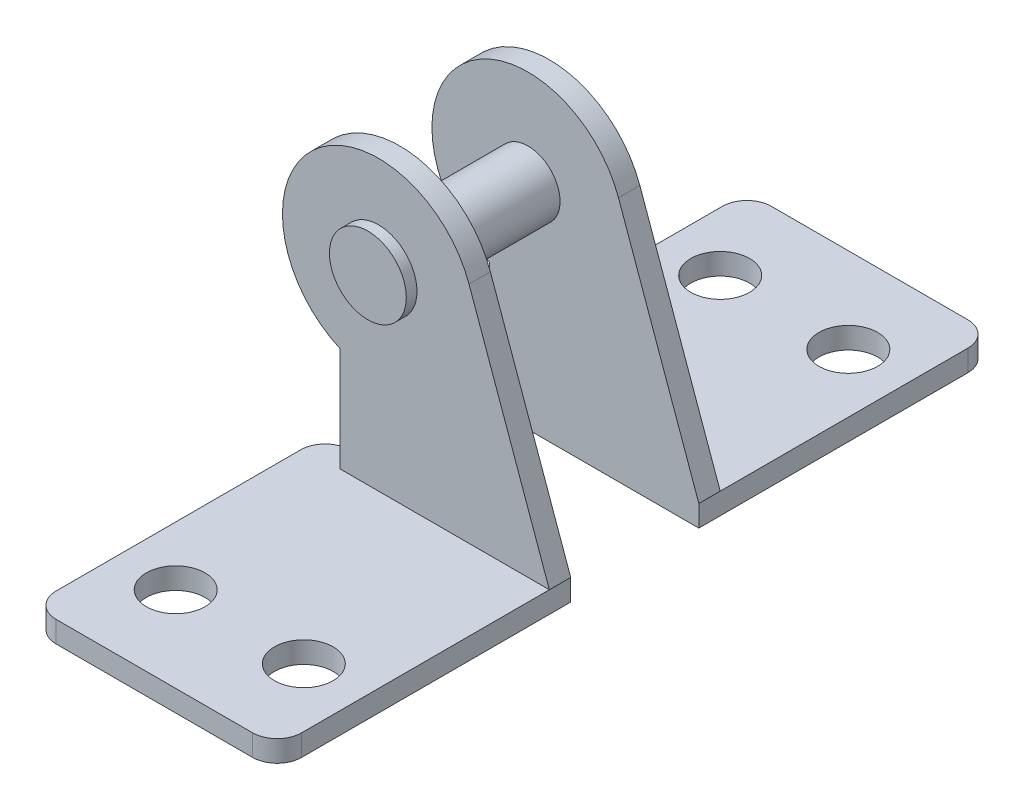
ISO-10303-21;
HEADER;
FILE_DESCRIPTION(('STEP AP214'),'2;1');
FILE_NAME('part.step','',(''),(''),'','','');
FILE_SCHEMA(('AUTOMOTIVE_DESIGN { 1 0 10303 214 1 1 1 1 }'));
ENDSEC;
DATA;
#1=APPLICATION_CONTEXT('core data for automotive mechanical design processes');
#2=APPLICATION_PROTOCOL_DEFINITION('international standard','automotive_design',2000,#1);
#3=PRODUCT_CONTEXT('',#1,'mechanical');
#4=PRODUCT('Part','Part','',(#3));
#5=PRODUCT_RELATED_PRODUCT_CATEGORY('part','',(#4));
#6=PRODUCT_DEFINITION_FORMATION('','',#4);
#7=PRODUCT_DEFINITION_CONTEXT('part definition',#1,'design');
#8=PRODUCT_DEFINITION('design','',#6,#7);
#9=PRODUCT_DEFINITION_SHAPE('','',#8);
#10=(LENGTH_UNIT() NAMED_UNIT(*) SI_UNIT(.MILLI.,.METRE.));
#11=(NAMED_UNIT(*) PLANE_ANGLE_UNIT() SI_UNIT($,.RADIAN.));
#12=(NAMED_UNIT(*) SI_UNIT($,.STERADIAN.) SOLID_ANGLE_UNIT());
#13=UNCERTAINTY_MEASURE_WITH_UNIT(LENGTH_MEASURE(1.E-05),#10,'distance_accuracy_value','');
#14=(GEOMETRIC_REPRESENTATION_CONTEXT(3) GLOBAL_UNCERTAINTY_ASSIGNED_CONTEXT((#13)) GLOBAL_UNIT_ASSIGNED_CONTEXT((#10,
#11,#12)) REPRESENTATION_CONTEXT('',''));
#15=CARTESIAN_POINT('',(0.,0.,0.));
#16=DIRECTION('',(0.,0.,1.));
#17=DIRECTION('',(1.,0.,0.));
#18=AXIS2_PLACEMENT_3D('',#15,#16,#17);
#19=CARTESIAN_POINT('',(-11.5,2.,-33.5));
#20=DIRECTION('',(0.,1.,0.));
#21=DIRECTION('',(0.,0.,1.));
#22=AXIS2_PLACEMENT_3D('',#19,#20,#21);
#23=PLANE('',#22);
#24=CARTESIAN_POINT('',(-5.99999999999999,2.,25.5));
#25=DIRECTION('',(0.,1.,0.));
#26=DIRECTION('',(0.,0.,-1.));
#27=AXIS2_PLACEMENT_3D('',#24,#25,#26);
#28=CIRCLE('',#27,2.75);
#29=CARTESIAN_POINT('',(-5.99999999999999,2.,22.75));
#30=VERTEX_POINT('',#29);
#31=EDGE_CURVE('E484',#30,#30,#28,.T.);
#32=ORIENTED_EDGE('',*,*,#31,.F.);
#33=EDGE_LOOP('',(#32));
#34=FACE_BOUND('',#33,.T.);
#35=CARTESIAN_POINT('',(6.00000000000001,2.,25.5));
#36=DIRECTION('',(0.,1.,0.));
#37=DIRECTION('',(0.,0.,1.));
#38=AXIS2_PLACEMENT_3D('',#35,#36,#37);
#39=CIRCLE('',#38,2.75);
#40=CARTESIAN_POINT('',(6.00000000000001,2.,28.25));
#41=VERTEX_POINT('',#40);
#42=EDGE_CURVE('E478',#41,#41,#39,.T.);
#43=ORIENTED_EDGE('',*,*,#42,.F.);
#44=EDGE_LOOP('',(#43));
#45=FACE_BOUND('',#44,.T.);
#46=DIRECTION('',(1.,0.,0.));
#47=VECTOR('',#46,1.);
#48=CARTESIAN_POINT('',(-11.5,2.,6.));
#49=LINE('',#48,#47);
#50=CARTESIAN_POINT('',(-9.2,2.,6.));
#51=VERTEX_POINT('',#50);
#52=CARTESIAN_POINT('',(-8.1,2.,6.));
#53=VERTEX_POINT('',#52);
#54=EDGE_CURVE('E313',#51,#53,#49,.T.);
#55=ORIENTED_EDGE('',*,*,#54,.F.);
#56=CARTESIAN_POINT('',(-9.2,2.,8.3));
#57=DIRECTION('',(0.,1.,0.));
#58=DIRECTION('',(0.,0.,1.));
#59=AXIS2_PLACEMENT_3D('',#56,#57,#58);
#60=CIRCLE('',#59,2.3);
#61=CARTESIAN_POINT('',(-11.5,2.,8.3));
#62=VERTEX_POINT('',#61);
#63=EDGE_CURVE('E234',#51,#62,#60,.T.);
#64=ORIENTED_EDGE('',*,*,#63,.T.);
#65=DIRECTION('',(0.,0.,1.));
#66=VECTOR('',#65,1.);
#67=CARTESIAN_POINT('',(-11.5,2.,-33.5));
#68=LINE('',#67,#66);
#69=CARTESIAN_POINT('',(-11.5,2.,31.2));
#70=VERTEX_POINT('',#69);
#71=EDGE_CURVE('E289',#62,#70,#68,.T.);
#72=ORIENTED_EDGE('',*,*,#71,.T.);
#73=CARTESIAN_POINT('',(-9.2,2.,31.2));
#74=DIRECTION('',(0.,1.,0.));
#75=DIRECTION('',(0.,0.,1.));
#76=AXIS2_PLACEMENT_3D('',#73,#74,#75);
#77=CIRCLE('',#76,2.3);
#78=CARTESIAN_POINT('',(-9.2,2.,33.5));
#79=VERTEX_POINT('',#78);
#80=EDGE_CURVE('E232',#70,#79,#77,.T.);
#81=ORIENTED_EDGE('',*,*,#80,.T.);
#82=DIRECTION('',(-1.,0.,0.));
#83=VECTOR('',#82,1.);
#84=CARTESIAN_POINT('',(-11.5,2.,33.5));
#85=LINE('',#84,#83);
#86=CARTESIAN_POINT('',(9.2,2.,33.5));
#87=VERTEX_POINT('',#86);
#88=EDGE_CURVE('E273',#87,#79,#85,.T.);
#89=ORIENTED_EDGE('',*,*,#88,.F.);
#90=CARTESIAN_POINT('',(9.2,2.,31.2));
#91=DIRECTION('',(0.,1.,0.));
#92=DIRECTION('',(0.,0.,1.));
#93=AXIS2_PLACEMENT_3D('',#90,#91,#92);
#94=CIRCLE('',#93,2.3);
#95=CARTESIAN_POINT('',(11.5,2.,31.2));
#96=VERTEX_POINT('',#95);
#97=EDGE_CURVE('E230',#87,#96,#94,.T.);
#98=ORIENTED_EDGE('',*,*,#97,.T.);
#99=DIRECTION('',(0.,0.,1.));
#100=VECTOR('',#99,1.);
#101=CARTESIAN_POINT('',(11.5,2.,-33.5));
#102=LINE('',#101,#100);
#103=CARTESIAN_POINT('',(11.5,2.,8.));
#104=VERTEX_POINT('',#103);
#105=EDGE_CURVE('E207',#104,#96,#102,.T.);
#106=ORIENTED_EDGE('',*,*,#105,.F.);
#107=DIRECTION('',(1.,0.,0.));
#108=VECTOR('',#107,1.);
#109=CARTESIAN_POINT('',(-11.5,2.,8.));
#110=LINE('',#109,#108);
#111=CARTESIAN_POINT('',(-8.1,2.,8.));
#112=VERTEX_POINT('',#111);
#113=EDGE_CURVE('E277',#112,#104,#110,.T.);
#114=ORIENTED_EDGE('',*,*,#113,.F.);
#115=DIRECTION('',(0.,0.,1.));
#116=VECTOR('',#115,1.);
#117=CARTESIAN_POINT('',(-8.1,2.,-33.5));
#118=LINE('',#117,#116);
#119=EDGE_CURVE('E215',#53,#112,#118,.T.);
#120=ORIENTED_EDGE('',*,*,#119,.F.);
#121=EDGE_LOOP('',(#55,#64,#72,#81,#89,#98,#106,#114,#120));
#122=FACE_BOUND('',#121,.T.);
#123=ADVANCED_FACE('F33',(#34,#45,#122),#23,.T.);
#124=CARTESIAN_POINT('',(11.5,0.,-33.5));
#125=DIRECTION('',(0.,-1.,0.));
#126=DIRECTION('',(0.,0.,-1.));
#127=AXIS2_PLACEMENT_3D('',#124,#125,#126);
#128=PLANE('',#127);
#129=CARTESIAN_POINT('',(-5.99999999999999,0.,25.5));
#130=DIRECTION('',(0.,1.,0.));
#131=DIRECTION('',(0.,0.,-1.));
#132=AXIS2_PLACEMENT_3D('',#129,#130,#131);
#133=CIRCLE('',#132,2.75);
#134=CARTESIAN_POINT('',(-5.99999999999999,0.,22.75));
#135=VERTEX_POINT('',#134);
#136=EDGE_CURVE('E481',#135,#135,#133,.T.);
#137=ORIENTED_EDGE('',*,*,#136,.T.);
#138=EDGE_LOOP('',(#137));
#139=FACE_BOUND('',#138,.T.);
#140=CARTESIAN_POINT('',(6.00000000000001,0.,25.5));
#141=DIRECTION('',(0.,1.,0.));
#142=DIRECTION('',(0.,0.,1.));
#143=AXIS2_PLACEMENT_3D('',#140,#141,#142);
#144=CIRCLE('',#143,2.75);
#145=CARTESIAN_POINT('',(6.00000000000001,0.,28.25));
#146=VERTEX_POINT('',#145);
#147=EDGE_CURVE('E475',#146,#146,#144,.T.);
#148=ORIENTED_EDGE('',*,*,#147,.T.);
#149=EDGE_LOOP('',(#148));
#150=FACE_BOUND('',#149,.T.);
#151=DIRECTION('',(0.,0.,1.));
#152=VECTOR('',#151,1.);
#153=CARTESIAN_POINT('',(-11.5,0.,-33.5));
#154=LINE('',#153,#152);
#155=CARTESIAN_POINT('',(-11.5,0.,8.3));
#156=VERTEX_POINT('',#155);
#157=CARTESIAN_POINT('',(-11.5,0.,31.2));
#158=VERTEX_POINT('',#157);
#159=EDGE_CURVE('E286',#156,#158,#154,.T.);
#160=ORIENTED_EDGE('',*,*,#159,.F.);
#161=CARTESIAN_POINT('',(-9.2,0.,8.3));
#162=DIRECTION('',(0.,-1.,0.));
#163=DIRECTION('',(0.,0.,-1.));
#164=AXIS2_PLACEMENT_3D('',#161,#162,#163);
#165=CIRCLE('',#164,2.3);
#166=CARTESIAN_POINT('',(-9.2,0.,6.));
#167=VERTEX_POINT('',#166);
#168=EDGE_CURVE('E184',#156,#167,#165,.T.);
#169=ORIENTED_EDGE('',*,*,#168,.T.);
#170=DIRECTION('',(1.,0.,0.));
#171=VECTOR('',#170,1.);
#172=CARTESIAN_POINT('',(-28.839366473064,0.,6.));
#173=LINE('',#172,#171);
#174=CARTESIAN_POINT('',(11.5,0.,6.));
#175=VERTEX_POINT('',#174);
#176=EDGE_CURVE('E177',#167,#175,#173,.T.);
#177=ORIENTED_EDGE('',*,*,#176,.T.);
#178=DIRECTION('',(0.,0.,1.));
#179=VECTOR('',#178,1.);
#180=CARTESIAN_POINT('',(11.5,0.,-33.5));
#181=LINE('',#180,#179);
#182=CARTESIAN_POINT('',(11.5,0.,31.2));
#183=VERTEX_POINT('',#182);
#184=EDGE_CURVE('E182',#175,#183,#181,.T.);
#185=ORIENTED_EDGE('',*,*,#184,.T.);
#186=CARTESIAN_POINT('',(9.2,0.,31.2));
#187=DIRECTION('',(0.,-1.,0.));
#188=DIRECTION('',(0.,0.,-1.));
#189=AXIS2_PLACEMENT_3D('',#186,#187,#188);
#190=CIRCLE('',#189,2.3);
#191=CARTESIAN_POINT('',(9.2,0.,33.5));
#192=VERTEX_POINT('',#191);
#193=EDGE_CURVE('E223',#183,#192,#190,.T.);
#194=ORIENTED_EDGE('',*,*,#193,.T.);
#195=DIRECTION('',(1.,0.,0.));
#196=VECTOR('',#195,1.);
#197=CARTESIAN_POINT('',(11.5,0.,33.5));
#198=LINE('',#197,#196);
#199=CARTESIAN_POINT('',(-9.2,0.,33.5));
#200=VERTEX_POINT('',#199);
#201=EDGE_CURVE('E270',#200,#192,#198,.T.);
#202=ORIENTED_EDGE('',*,*,#201,.F.);
#203=CARTESIAN_POINT('',(-9.2,0.,31.2));
#204=DIRECTION('',(0.,-1.,0.));
#205=DIRECTION('',(0.,0.,-1.));
#206=AXIS2_PLACEMENT_3D('',#203,#204,#205);
#207=CIRCLE('',#206,2.3);
#208=EDGE_CURVE('E225',#200,#158,#207,.T.);
#209=ORIENTED_EDGE('',*,*,#208,.T.);
#210=EDGE_LOOP('',(#160,#169,#177,#185,#194,#202,#209));
#211=FACE_BOUND('',#210,.T.);
#212=ADVANCED_FACE('F180',(#139,#150,#211),#128,.T.);
#213=CARTESIAN_POINT('',(-11.5,0.,-33.5));
#214=DIRECTION('',(-1.,0.,0.));
#215=DIRECTION('',(0.,0.,1.));
#216=AXIS2_PLACEMENT_3D('',#213,#214,#215);
#217=PLANE('',#216);
#218=ORIENTED_EDGE('',*,*,#71,.F.);
#219=DIRECTION('',(0.,-1.,0.));
#220=VECTOR('',#219,1.);
#221=CARTESIAN_POINT('',(-11.5,0.,8.3));
#222=LINE('',#221,#220);
#223=EDGE_CURVE('E220',#62,#156,#222,.T.);
#224=ORIENTED_EDGE('',*,*,#223,.T.);
#225=ORIENTED_EDGE('',*,*,#159,.T.);
#226=DIRECTION('',(0.,-1.,0.));
#227=VECTOR('',#226,1.);
#228=CARTESIAN_POINT('',(-11.5,2.,31.2));
#229=LINE('',#228,#227);
#230=EDGE_CURVE('E217',#158,#70,#229,.F.);
#231=ORIENTED_EDGE('',*,*,#230,.T.);
#232=EDGE_LOOP('',(#218,#224,#225,#231));
#233=FACE_BOUND('',#232,.T.);
#234=ADVANCED_FACE('F307',(#233),#217,.T.);
#235=CARTESIAN_POINT('',(11.5,2.,-33.5));
#236=DIRECTION('',(1.,0.,0.));
#237=DIRECTION('',(0.,0.,-1.));
#238=AXIS2_PLACEMENT_3D('',#235,#236,#237);
#239=PLANE('',#238);
#240=ORIENTED_EDGE('',*,*,#105,.T.);
#241=DIRECTION('',(0.,1.,0.));
#242=VECTOR('',#241,1.);
#243=CARTESIAN_POINT('',(11.5,0.,31.2));
#244=LINE('',#243,#242);
#245=EDGE_CURVE('E11',#96,#183,#244,.F.);
#246=ORIENTED_EDGE('',*,*,#245,.T.);
#247=ORIENTED_EDGE('',*,*,#184,.F.);
#248=DIRECTION('',(0.,-1.,0.));
#249=VECTOR('',#248,1.);
#250=CARTESIAN_POINT('',(11.5,12.516134774251,6.));
#251=LINE('',#250,#249);
#252=CARTESIAN_POINT('',(11.5,2.,6.));
#253=VERTEX_POINT('',#252);
#254=EDGE_CURVE('E191',#253,#175,#251,.T.);
#255=ORIENTED_EDGE('',*,*,#254,.F.);
#256=DIRECTION('',(0.,0.,1.));
#257=VECTOR('',#256,1.);
#258=CARTESIAN_POINT('',(11.5,2.,6.));
#259=LINE('',#258,#257);
#260=EDGE_CURVE('E300',#253,#104,#259,.T.);
#261=ORIENTED_EDGE('',*,*,#260,.T.);
#262=EDGE_LOOP('',(#240,#246,#247,#255,#261));
#263=FACE_BOUND('',#262,.T.);
#264=ADVANCED_FACE('F202',(#263),#239,.T.);
#265=CARTESIAN_POINT('',(-4.5,20.,8.));
#266=DIRECTION('',(0.,0.,1.));
#267=DIRECTION('',(1.,0.,0.));
#268=AXIS2_PLACEMENT_3D('',#265,#266,#267);
#269=PLANE('',#268);
#270=DIRECTION('',(0.,-1.,0.));
#271=VECTOR('',#270,1.);
#272=CARTESIAN_POINT('',(-8.1,11.7513637490795,8.));
#273=LINE('',#272,#271);
#274=CARTESIAN_POINT('',(-8.1,11.7513637490795,8.));
#275=VERTEX_POINT('',#274);
#276=EDGE_CURVE('E378',#275,#112,#273,.T.);
#277=ORIENTED_EDGE('',*,*,#276,.T.);
#278=ORIENTED_EDGE('',*,*,#113,.T.);
#279=DIRECTION('',(-0.336918838722446,0.941533693562752,0.));
#280=VECTOR('',#279,1.);
#281=CARTESIAN_POINT('',(3.97380324206476,23.032269548502,8.));
#282=LINE('',#281,#280);
#283=CARTESIAN_POINT('',(3.97380324206476,23.032269548502,8.));
#284=VERTEX_POINT('',#283);
#285=EDGE_CURVE('E372',#104,#284,#282,.T.);
#286=ORIENTED_EDGE('',*,*,#285,.T.);
#287=CARTESIAN_POINT('',(-4.5,20.,8.));
#288=DIRECTION('',(0.,0.,1.));
#289=DIRECTION('',(1.,0.,0.));
#290=AXIS2_PLACEMENT_3D('',#287,#288,#289);
#291=CIRCLE('',#290,9.);
#292=EDGE_CURVE('E368',#284,#275,#291,.T.);
#293=ORIENTED_EDGE('',*,*,#292,.T.);
#294=EDGE_LOOP('',(#277,#278,#286,#293));
#295=FACE_BOUND('',#294,.T.);
#296=CARTESIAN_POINT('',(-4.5,20.,8.));
#297=DIRECTION('',(0.,0.,1.));
#298=DIRECTION('',(1.,0.,0.));
#299=AXIS2_PLACEMENT_3D('',#296,#297,#298);
#300=CIRCLE('',#299,3.6);
#301=CARTESIAN_POINT('',(-0.900000000000003,20.,8.));
#302=VERTEX_POINT('',#301);
#303=EDGE_CURVE('E328',#302,#302,#300,.T.);
#304=ORIENTED_EDGE('',*,*,#303,.F.);
#305=EDGE_LOOP('',(#304));
#306=FACE_BOUND('',#305,.T.);
#307=ADVANCED_FACE('F454',(#295,#306),#269,.T.);
#308=CARTESIAN_POINT('',(6.,2.,-25.5));
#309=DIRECTION('',(0.,1.,0.));
#310=DIRECTION('',(0.,0.,-1.));
#311=AXIS2_PLACEMENT_3D('',#308,#309,#310);
#312=CIRCLE('',#311,2.75);
#313=CARTESIAN_POINT('',(6.,2.,-28.25));
#314=VERTEX_POINT('',#313);
#315=EDGE_CURVE('E466',#314,#314,#312,.T.);
#316=ORIENTED_EDGE('',*,*,#315,.F.);
#317=EDGE_LOOP('',(#316));
#318=FACE_BOUND('',#317,.T.);
#319=CARTESIAN_POINT('',(-6.,2.,-25.5));
#320=DIRECTION('',(0.,1.,0.));
#321=DIRECTION('',(0.,0.,1.));
#322=AXIS2_PLACEMENT_3D('',#319,#320,#321);
#323=CIRCLE('',#322,2.75);
#324=CARTESIAN_POINT('',(-6.,2.,-22.75));
#325=VERTEX_POINT('',#324);
#326=EDGE_CURVE('E415',#325,#325,#323,.T.);
#327=ORIENTED_EDGE('',*,*,#326,.F.);
#328=EDGE_LOOP('',(#327));
#329=FACE_BOUND('',#328,.T.);
#330=CARTESIAN_POINT('',(-11.5,2.,-31.2));
#331=VERTEX_POINT('',#330);
#332=CARTESIAN_POINT('',(-11.5,2.,-8.3));
#333=VERTEX_POINT('',#332);
#334=EDGE_CURVE('E287',#331,#333,#68,.T.);
#335=ORIENTED_EDGE('',*,*,#334,.T.);
#336=CARTESIAN_POINT('',(-9.2,2.,-8.3));
#337=DIRECTION('',(0.,1.,0.));
#338=DIRECTION('',(0.,0.,1.));
#339=AXIS2_PLACEMENT_3D('',#336,#337,#338);
#340=CIRCLE('',#339,2.3);
#341=CARTESIAN_POINT('',(-9.2,2.,-6.));
#342=VERTEX_POINT('',#341);
#343=EDGE_CURVE('E246',#333,#342,#340,.T.);
#344=ORIENTED_EDGE('',*,*,#343,.T.);
#345=DIRECTION('',(-1.,0.,0.));
#346=VECTOR('',#345,1.);
#347=CARTESIAN_POINT('',(-11.5,2.,-6.));
#348=LINE('',#347,#346);
#349=CARTESIAN_POINT('',(-8.1,2.,-6.));
#350=VERTEX_POINT('',#349);
#351=EDGE_CURVE('E317',#350,#342,#348,.T.);
#352=ORIENTED_EDGE('',*,*,#351,.F.);
#353=DIRECTION('',(0.,0.,-1.));
#354=VECTOR('',#353,1.);
#355=CARTESIAN_POINT('',(-8.1,2.,-33.5));
#356=LINE('',#355,#354);
#357=CARTESIAN_POINT('',(-8.1,2.,-8.));
#358=VERTEX_POINT('',#357);
#359=EDGE_CURVE('E365',#350,#358,#356,.T.);
#360=ORIENTED_EDGE('',*,*,#359,.T.);
#361=DIRECTION('',(1.,0.,0.));
#362=VECTOR('',#361,1.);
#363=CARTESIAN_POINT('',(-11.5,2.,-8.));
#364=LINE('',#363,#362);
#365=CARTESIAN_POINT('',(11.5,2.,-8.));
#366=VERTEX_POINT('',#365);
#367=EDGE_CURVE('E362',#358,#366,#364,.T.);
#368=ORIENTED_EDGE('',*,*,#367,.T.);
#369=CARTESIAN_POINT('',(11.5,2.,-31.2));
#370=VERTEX_POINT('',#369);
#371=EDGE_CURVE('E213',#370,#366,#102,.T.);
#372=ORIENTED_EDGE('',*,*,#371,.F.);
#373=CARTESIAN_POINT('',(9.2,2.,-31.2));
#374=DIRECTION('',(0.,1.,0.));
#375=DIRECTION('',(0.,0.,1.));
#376=AXIS2_PLACEMENT_3D('',#373,#374,#375);
#377=CIRCLE('',#376,2.3);
#378=CARTESIAN_POINT('',(9.2,2.,-33.5));
#379=VERTEX_POINT('',#378);
#380=EDGE_CURVE('E244',#370,#379,#377,.T.);
#381=ORIENTED_EDGE('',*,*,#380,.T.);
#382=DIRECTION('',(-1.,0.,0.));
#383=VECTOR('',#382,1.);
#384=CARTESIAN_POINT('',(-11.5,2.,-33.5));
#385=LINE('',#384,#383);
#386=CARTESIAN_POINT('',(-9.2,2.,-33.5));
#387=VERTEX_POINT('',#386);
#388=EDGE_CURVE('E205',#379,#387,#385,.T.);
#389=ORIENTED_EDGE('',*,*,#388,.T.);
#390=CARTESIAN_POINT('',(-9.2,2.,-31.2));
#391=DIRECTION('',(0.,1.,0.));
#392=DIRECTION('',(0.,0.,1.));
#393=AXIS2_PLACEMENT_3D('',#390,#391,#392);
#394=CIRCLE('',#393,2.3);
#395=EDGE_CURVE('E242',#387,#331,#394,.T.);
#396=ORIENTED_EDGE('',*,*,#395,.T.);
#397=EDGE_LOOP('',(#335,#344,#352,#360,#368,#372,#381,#389,#396));
#398=FACE_BOUND('',#397,.T.);
#399=ADVANCED_FACE('F394',(#318,#329,#398),#23,.T.);
#400=CARTESIAN_POINT('',(6.,0.,-25.5));
#401=DIRECTION('',(0.,1.,0.));
#402=DIRECTION('',(0.,0.,-1.));
#403=AXIS2_PLACEMENT_3D('',#400,#401,#402);
#404=CIRCLE('',#403,2.75);
#405=CARTESIAN_POINT('',(6.,0.,-28.25));
#406=VERTEX_POINT('',#405);
#407=EDGE_CURVE('E470',#406,#406,#404,.T.);
#408=ORIENTED_EDGE('',*,*,#407,.T.);
#409=EDGE_LOOP('',(#408));
#410=FACE_BOUND('',#409,.T.);
#411=CARTESIAN_POINT('',(-6.,0.,-25.5));
#412=DIRECTION('',(0.,1.,0.));
#413=DIRECTION('',(0.,0.,1.));
#414=AXIS2_PLACEMENT_3D('',#411,#412,#413);
#415=CIRCLE('',#414,2.75);
#416=CARTESIAN_POINT('',(-6.,0.,-22.75));
#417=VERTEX_POINT('',#416);
#418=EDGE_CURVE('E199',#417,#417,#415,.T.);
#419=ORIENTED_EDGE('',*,*,#418,.T.);
#420=EDGE_LOOP('',(#419));
#421=FACE_BOUND('',#420,.T.);
#422=DIRECTION('',(1.,0.,0.));
#423=VECTOR('',#422,1.);
#424=CARTESIAN_POINT('',(-28.839366473064,0.,-6.));
#425=LINE('',#424,#423);
#426=CARTESIAN_POINT('',(-9.2,0.,-6.));
#427=VERTEX_POINT('',#426);
#428=CARTESIAN_POINT('',(11.5,0.,-6.));
#429=VERTEX_POINT('',#428);
#430=EDGE_CURVE('E187',#427,#429,#425,.T.);
#431=ORIENTED_EDGE('',*,*,#430,.F.);
#432=CARTESIAN_POINT('',(-9.2,0.,-8.3));
#433=DIRECTION('',(0.,-1.,0.));
#434=DIRECTION('',(0.,0.,-1.));
#435=AXIS2_PLACEMENT_3D('',#432,#433,#434);
#436=CIRCLE('',#435,2.3);
#437=CARTESIAN_POINT('',(-11.5,0.,-8.3));
#438=VERTEX_POINT('',#437);
#439=EDGE_CURVE('E253',#427,#438,#436,.T.);
#440=ORIENTED_EDGE('',*,*,#439,.T.);
#441=CARTESIAN_POINT('',(-11.5,0.,-31.2));
#442=VERTEX_POINT('',#441);
#443=EDGE_CURVE('E218',#442,#438,#154,.T.);
#444=ORIENTED_EDGE('',*,*,#443,.F.);
#445=CARTESIAN_POINT('',(-9.2,0.,-31.2));
#446=DIRECTION('',(0.,-1.,0.));
#447=DIRECTION('',(0.,0.,-1.));
#448=AXIS2_PLACEMENT_3D('',#445,#446,#447);
#449=CIRCLE('',#448,2.3);
#450=CARTESIAN_POINT('',(-9.2,0.,-33.5));
#451=VERTEX_POINT('',#450);
#452=EDGE_CURVE('E250',#442,#451,#449,.T.);
#453=ORIENTED_EDGE('',*,*,#452,.T.);
#454=DIRECTION('',(1.,0.,0.));
#455=VECTOR('',#454,1.);
#456=CARTESIAN_POINT('',(11.5,0.,-33.5));
#457=LINE('',#456,#455);
#458=CARTESIAN_POINT('',(9.2,0.,-33.5));
#459=VERTEX_POINT('',#458);
#460=EDGE_CURVE('E209',#451,#459,#457,.T.);
#461=ORIENTED_EDGE('',*,*,#460,.T.);
#462=CARTESIAN_POINT('',(9.2,0.,-31.2));
#463=DIRECTION('',(0.,-1.,0.));
#464=DIRECTION('',(0.,0.,-1.));
#465=AXIS2_PLACEMENT_3D('',#462,#463,#464);
#466=CIRCLE('',#465,2.3);
#467=CARTESIAN_POINT('',(11.5,0.,-31.2));
#468=VERTEX_POINT('',#467);
#469=EDGE_CURVE('E48',#459,#468,#466,.T.);
#470=ORIENTED_EDGE('',*,*,#469,.T.);
#471=EDGE_CURVE('E204',#468,#429,#181,.T.);
#472=ORIENTED_EDGE('',*,*,#471,.T.);
#473=EDGE_LOOP('',(#431,#440,#444,#453,#461,#470,#472));
#474=FACE_BOUND('',#473,.T.);
#475=ADVANCED_FACE('F386',(#410,#421,#474),#128,.T.);
#476=ORIENTED_EDGE('',*,*,#443,.T.);
#477=DIRECTION('',(0.,1.,0.));
#478=VECTOR('',#477,1.);
#479=CARTESIAN_POINT('',(-11.5,0.,-8.3));
#480=LINE('',#479,#478);
#481=EDGE_CURVE('E239',#438,#333,#480,.T.);
#482=ORIENTED_EDGE('',*,*,#481,.T.);
#483=ORIENTED_EDGE('',*,*,#334,.F.);
#484=DIRECTION('',(0.,-1.,0.));
#485=VECTOR('',#484,1.);
#486=CARTESIAN_POINT('',(-11.5,0.,-31.2));
#487=LINE('',#486,#485);
#488=EDGE_CURVE('E236',#331,#442,#487,.T.);
#489=ORIENTED_EDGE('',*,*,#488,.T.);
#490=EDGE_LOOP('',(#476,#482,#483,#489));
#491=FACE_BOUND('',#490,.T.);
#492=ADVANCED_FACE('F426',(#491),#217,.T.);
#493=ORIENTED_EDGE('',*,*,#471,.F.);
#494=DIRECTION('',(0.,1.,0.));
#495=VECTOR('',#494,1.);
#496=CARTESIAN_POINT('',(11.5,2.,-31.2));
#497=LINE('',#496,#495);
#498=EDGE_CURVE('E255',#468,#370,#497,.T.);
#499=ORIENTED_EDGE('',*,*,#498,.T.);
#500=ORIENTED_EDGE('',*,*,#371,.T.);
#501=DIRECTION('',(0.,0.,-1.));
#502=VECTOR('',#501,1.);
#503=CARTESIAN_POINT('',(11.5,2.,-6.));
#504=LINE('',#503,#502);
#505=CARTESIAN_POINT('',(11.5,1.99999999999993,-6.));
#506=VERTEX_POINT('',#505);
#507=EDGE_CURVE('E357',#506,#366,#504,.T.);
#508=ORIENTED_EDGE('',*,*,#507,.F.);
#509=DIRECTION('',(0.,1.,0.));
#510=VECTOR('',#509,1.);
#511=CARTESIAN_POINT('',(11.5,0.,-6.));
#512=LINE('',#511,#510);
#513=EDGE_CURVE('E188',#429,#506,#512,.T.);
#514=ORIENTED_EDGE('',*,*,#513,.F.);
#515=EDGE_LOOP('',(#493,#499,#500,#508,#514));
#516=FACE_BOUND('',#515,.T.);
#517=ADVANCED_FACE('F392',(#516),#239,.T.);
#518=CARTESIAN_POINT('',(-11.5,0.,-33.5));
#519=DIRECTION('',(0.,0.,-1.));
#520=DIRECTION('',(-1.,0.,0.));
#521=AXIS2_PLACEMENT_3D('',#518,#519,#520);
#522=PLANE('',#521);
#523=ORIENTED_EDGE('',*,*,#388,.F.);
#524=DIRECTION('',(0.,1.,0.));
#525=VECTOR('',#524,1.);
#526=CARTESIAN_POINT('',(9.2,0.,-33.5));
#527=LINE('',#526,#525);
#528=EDGE_CURVE('E56',#379,#459,#527,.F.);
#529=ORIENTED_EDGE('',*,*,#528,.T.);
#530=ORIENTED_EDGE('',*,*,#460,.F.);
#531=DIRECTION('',(0.,-1.,0.));
#532=VECTOR('',#531,1.);
#533=CARTESIAN_POINT('',(-9.2,0.,-33.5));
#534=LINE('',#533,#532);
#535=EDGE_CURVE('E258',#451,#387,#534,.F.);
#536=ORIENTED_EDGE('',*,*,#535,.T.);
#537=EDGE_LOOP('',(#523,#529,#530,#536));
#538=FACE_BOUND('',#537,.T.);
#539=ADVANCED_FACE('F431',(#538),#522,.T.);
#540=CARTESIAN_POINT('',(-11.5,0.,33.5));
#541=DIRECTION('',(0.,0.,-1.));
#542=DIRECTION('',(-1.,0.,0.));
#543=AXIS2_PLACEMENT_3D('',#540,#541,#542);
#544=PLANE('',#543);
#545=ORIENTED_EDGE('',*,*,#88,.T.);
#546=DIRECTION('',(0.,-1.,0.));
#547=VECTOR('',#546,1.);
#548=CARTESIAN_POINT('',(-9.2,0.,33.5));
#549=LINE('',#548,#547);
#550=EDGE_CURVE('E41',#79,#200,#549,.T.);
#551=ORIENTED_EDGE('',*,*,#550,.T.);
#552=ORIENTED_EDGE('',*,*,#201,.T.);
#553=DIRECTION('',(0.,1.,0.));
#554=VECTOR('',#553,1.);
#555=CARTESIAN_POINT('',(9.2,2.,33.5));
#556=LINE('',#555,#554);
#557=EDGE_CURVE('E261',#192,#87,#556,.T.);
#558=ORIENTED_EDGE('',*,*,#557,.T.);
#559=EDGE_LOOP('',(#545,#551,#552,#558));
#560=FACE_BOUND('',#559,.T.);
#561=ADVANCED_FACE('F269',(#560),#544,.F.);
#562=CARTESIAN_POINT('',(-4.5,20.,6.));
#563=DIRECTION('',(0.,0.,1.));
#564=DIRECTION('',(1.,0.,0.));
#565=AXIS2_PLACEMENT_3D('',#562,#563,#564);
#566=CYLINDRICAL_SURFACE('',#565,9.);
#567=ORIENTED_EDGE('',*,*,#292,.F.);
#568=DIRECTION('',(0.,0.,1.));
#569=VECTOR('',#568,1.);
#570=CARTESIAN_POINT('',(3.97380324206476,23.032269548502,6.));
#571=LINE('',#570,#569);
#572=CARTESIAN_POINT('',(3.97380324206476,23.032269548502,6.));
#573=VERTEX_POINT('',#572);
#574=EDGE_CURVE('E281',#573,#284,#571,.T.);
#575=ORIENTED_EDGE('',*,*,#574,.F.);
#576=CARTESIAN_POINT('',(-4.5,20.,6.));
#577=DIRECTION('',(0.,0.,1.));
#578=DIRECTION('',(1.,0.,0.));
#579=AXIS2_PLACEMENT_3D('',#576,#577,#578);
#580=CIRCLE('',#579,9.);
#581=CARTESIAN_POINT('',(-8.1,11.7513637490795,6.));
#582=VERTEX_POINT('',#581);
#583=EDGE_CURVE('E369',#573,#582,#580,.T.);
#584=ORIENTED_EDGE('',*,*,#583,.T.);
#585=DIRECTION('',(0.,0.,1.));
#586=VECTOR('',#585,1.);
#587=CARTESIAN_POINT('',(-8.1,11.7513637490795,6.));
#588=LINE('',#587,#586);
#589=EDGE_CURVE('E375',#582,#275,#588,.T.);
#590=ORIENTED_EDGE('',*,*,#589,.T.);
#591=EDGE_LOOP('',(#567,#575,#584,#590));
#592=FACE_BOUND('',#591,.T.);
#593=ADVANCED_FACE('F438',(#592),#566,.T.);
#594=CARTESIAN_POINT('',(3.97380324206476,23.032269548502,6.));
#595=DIRECTION('',(0.941533693562752,0.336918838722446,0.));
#596=DIRECTION('',(-0.336918838722446,0.941533693562752,0.));
#597=AXIS2_PLACEMENT_3D('',#594,#595,#596);
#598=PLANE('',#597);
#599=ORIENTED_EDGE('',*,*,#285,.F.);
#600=ORIENTED_EDGE('',*,*,#260,.F.);
#601=DIRECTION('',(-0.336918838722446,0.941533693562752,0.));
#602=VECTOR('',#601,1.);
#603=CARTESIAN_POINT('',(3.97380324206476,23.032269548502,6.));
#604=LINE('',#603,#602);
#605=EDGE_CURVE('E195',#253,#573,#604,.T.);
#606=ORIENTED_EDGE('',*,*,#605,.T.);
#607=ORIENTED_EDGE('',*,*,#574,.T.);
#608=EDGE_LOOP('',(#599,#600,#606,#607));
#609=FACE_BOUND('',#608,.T.);
#610=ADVANCED_FACE('F546',(#609),#598,.T.);
#611=CARTESIAN_POINT('',(-8.1,11.7513637490795,6.));
#612=DIRECTION('',(-1.,0.,0.));
#613=DIRECTION('',(0.,-1.,0.));
#614=AXIS2_PLACEMENT_3D('',#611,#612,#613);
#615=PLANE('',#614);
#616=DIRECTION('',(0.,-1.,0.));
#617=VECTOR('',#616,1.);
#618=CARTESIAN_POINT('',(-8.1,11.7513637490795,6.));
#619=LINE('',#618,#617);
#620=EDGE_CURVE('E371',#582,#53,#619,.T.);
#621=ORIENTED_EDGE('',*,*,#620,.T.);
#622=ORIENTED_EDGE('',*,*,#119,.T.);
#623=ORIENTED_EDGE('',*,*,#276,.F.);
#624=ORIENTED_EDGE('',*,*,#589,.F.);
#625=EDGE_LOOP('',(#621,#622,#623,#624));
#626=FACE_BOUND('',#625,.T.);
#627=ADVANCED_FACE('F544',(#626),#615,.T.);
#628=CARTESIAN_POINT('',(-4.5,20.,6.));
#629=DIRECTION('',(0.,0.,1.));
#630=DIRECTION('',(1.,0.,0.));
#631=AXIS2_PLACEMENT_3D('',#628,#629,#630);
#632=PLANE('',#631);
#633=ORIENTED_EDGE('',*,*,#176,.F.);
#634=DIRECTION('',(0.,-1.,0.));
#635=VECTOR('',#634,1.);
#636=CARTESIAN_POINT('',(-9.2,2.,6.));
#637=LINE('',#636,#635);
#638=EDGE_CURVE('E228',#167,#51,#637,.F.);
#639=ORIENTED_EDGE('',*,*,#638,.T.);
#640=ORIENTED_EDGE('',*,*,#54,.T.);
#641=ORIENTED_EDGE('',*,*,#620,.F.);
#642=ORIENTED_EDGE('',*,*,#583,.F.);
#643=ORIENTED_EDGE('',*,*,#605,.F.);
#644=ORIENTED_EDGE('',*,*,#254,.T.);
#645=EDGE_LOOP('',(#633,#639,#640,#641,#642,#643,#644));
#646=FACE_BOUND('',#645,.T.);
#647=CARTESIAN_POINT('',(-4.5,20.,6.));
#648=DIRECTION('',(0.,0.,1.));
#649=DIRECTION('',(1.,0.,0.));
#650=AXIS2_PLACEMENT_3D('',#647,#648,#649);
#651=CIRCLE('',#650,3.);
#652=CARTESIAN_POINT('',(-1.5,20.,6.));
#653=VERTEX_POINT('',#652);
#654=EDGE_CURVE('E316',#653,#653,#651,.F.);
#655=ORIENTED_EDGE('',*,*,#654,.F.);
#656=EDGE_LOOP('',(#655));
#657=FACE_BOUND('',#656,.T.);
#658=ADVANCED_FACE('F192',(#646,#657),#632,.F.);
#659=CARTESIAN_POINT('',(-4.5,20.,-6.));
#660=DIRECTION('',(0.,0.,1.));
#661=DIRECTION('',(1.,0.,0.));
#662=AXIS2_PLACEMENT_3D('',#659,#660,#661);
#663=PLANE('',#662);
#664=ORIENTED_EDGE('',*,*,#351,.T.);
#665=DIRECTION('',(0.,1.,0.));
#666=VECTOR('',#665,1.);
#667=CARTESIAN_POINT('',(-9.2,20.,-6.));
#668=LINE('',#667,#666);
#669=EDGE_CURVE('E248',#342,#427,#668,.F.);
#670=ORIENTED_EDGE('',*,*,#669,.T.);
#671=ORIENTED_EDGE('',*,*,#430,.T.);
#672=ORIENTED_EDGE('',*,*,#513,.T.);
#673=DIRECTION('',(-0.336918838722446,0.941533693562752,0.));
#674=VECTOR('',#673,1.);
#675=CARTESIAN_POINT('',(3.97380324206476,23.032269548502,-6.));
#676=LINE('',#675,#674);
#677=CARTESIAN_POINT('',(3.97380324206476,23.032269548502,-6.));
#678=VERTEX_POINT('',#677);
#679=EDGE_CURVE('E346',#506,#678,#676,.T.);
#680=ORIENTED_EDGE('',*,*,#679,.T.);
#681=CARTESIAN_POINT('',(-4.5,20.,-6.));
#682=DIRECTION('',(0.,0.,1.));
#683=DIRECTION('',(1.,0.,0.));
#684=AXIS2_PLACEMENT_3D('',#681,#682,#683);
#685=CIRCLE('',#684,9.);
#686=CARTESIAN_POINT('',(-8.1,11.7513637490795,-6.));
#687=VERTEX_POINT('',#686);
#688=EDGE_CURVE('E340',#678,#687,#685,.T.);
#689=ORIENTED_EDGE('',*,*,#688,.T.);
#690=DIRECTION('',(0.,-1.,0.));
#691=VECTOR('',#690,1.);
#692=CARTESIAN_POINT('',(-8.1,11.7513637490795,-6.));
#693=LINE('',#692,#691);
#694=EDGE_CURVE('E342',#687,#350,#693,.T.);
#695=ORIENTED_EDGE('',*,*,#694,.T.);
#696=EDGE_LOOP('',(#664,#670,#671,#672,#680,#689,#695));
#697=FACE_BOUND('',#696,.T.);
#698=CARTESIAN_POINT('',(-4.5,20.,-6.));
#699=DIRECTION('',(0.,0.,1.));
#700=DIRECTION('',(1.,0.,0.));
#701=AXIS2_PLACEMENT_3D('',#698,#699,#700);
#702=CIRCLE('',#701,3.);
#703=CARTESIAN_POINT('',(-1.5,20.,-6.));
#704=VERTEX_POINT('',#703);
#705=EDGE_CURVE('E334',#704,#704,#702,.T.);
#706=ORIENTED_EDGE('',*,*,#705,.F.);
#707=EDGE_LOOP('',(#706));
#708=FACE_BOUND('',#707,.T.);
#709=ADVANCED_FACE('F418',(#697,#708),#663,.T.);
#710=CARTESIAN_POINT('',(-4.5,20.,-8.));
#711=DIRECTION('',(0.,0.,1.));
#712=DIRECTION('',(1.,0.,0.));
#713=AXIS2_PLACEMENT_3D('',#710,#711,#712);
#714=PLANE('',#713);
#715=CARTESIAN_POINT('',(-4.5,20.,-8.));
#716=DIRECTION('',(0.,0.,1.));
#717=DIRECTION('',(1.,0.,0.));
#718=AXIS2_PLACEMENT_3D('',#715,#716,#717);
#719=CIRCLE('',#718,3.6);
#720=CARTESIAN_POINT('',(-0.900000000000003,20.,-8.));
#721=VERTEX_POINT('',#720);
#722=EDGE_CURVE('E320',#721,#721,#719,.T.);
#723=ORIENTED_EDGE('',*,*,#722,.T.);
#724=EDGE_LOOP('',(#723));
#725=FACE_BOUND('',#724,.T.);
#726=ORIENTED_EDGE('',*,*,#367,.F.);
#727=DIRECTION('',(0.,-1.,0.));
#728=VECTOR('',#727,1.);
#729=CARTESIAN_POINT('',(-8.1,11.7513637490795,-8.));
#730=LINE('',#729,#728);
#731=CARTESIAN_POINT('',(-8.1,11.7513637490795,-8.));
#732=VERTEX_POINT('',#731);
#733=EDGE_CURVE('E351',#732,#358,#730,.T.);
#734=ORIENTED_EDGE('',*,*,#733,.F.);
#735=CARTESIAN_POINT('',(-4.5,20.,-8.));
#736=DIRECTION('',(0.,0.,1.));
#737=DIRECTION('',(1.,0.,0.));
#738=AXIS2_PLACEMENT_3D('',#735,#736,#737);
#739=CIRCLE('',#738,9.);
#740=CARTESIAN_POINT('',(3.97380324206476,23.032269548502,-8.));
#741=VERTEX_POINT('',#740);
#742=EDGE_CURVE('E339',#741,#732,#739,.T.);
#743=ORIENTED_EDGE('',*,*,#742,.F.);
#744=DIRECTION('',(-0.336918838722446,0.941533693562752,0.));
#745=VECTOR('',#744,1.);
#746=CARTESIAN_POINT('',(3.97380324206476,23.032269548502,-8.));
#747=LINE('',#746,#745);
#748=EDGE_CURVE('E343',#366,#741,#747,.T.);
#749=ORIENTED_EDGE('',*,*,#748,.F.);
#750=EDGE_LOOP('',(#726,#734,#743,#749));
#751=FACE_BOUND('',#750,.T.);
#752=ADVANCED_FACE('F398',(#725,#751),#714,.F.);
#753=CARTESIAN_POINT('',(-4.5,20.,-6.));
#754=DIRECTION('',(0.,0.,-1.));
#755=DIRECTION('',(-1.,0.,0.));
#756=AXIS2_PLACEMENT_3D('',#753,#754,#755);
#757=CYLINDRICAL_SURFACE('',#756,9.);
#758=ORIENTED_EDGE('',*,*,#742,.T.);
#759=DIRECTION('',(0.,0.,-1.));
#760=VECTOR('',#759,1.);
#761=CARTESIAN_POINT('',(-8.1,11.7513637490795,-6.));
#762=LINE('',#761,#760);
#763=EDGE_CURVE('E359',#687,#732,#762,.T.);
#764=ORIENTED_EDGE('',*,*,#763,.F.);
#765=ORIENTED_EDGE('',*,*,#688,.F.);
#766=DIRECTION('',(0.,0.,-1.));
#767=VECTOR('',#766,1.);
#768=CARTESIAN_POINT('',(3.97380324206476,23.032269548502,-6.));
#769=LINE('',#768,#767);
#770=EDGE_CURVE('E348',#678,#741,#769,.T.);
#771=ORIENTED_EDGE('',*,*,#770,.T.);
#772=EDGE_LOOP('',(#758,#764,#765,#771));
#773=FACE_BOUND('',#772,.T.);
#774=ADVANCED_FACE('F406',(#773),#757,.T.);
#775=CARTESIAN_POINT('',(-8.1,11.7513637490795,-6.));
#776=DIRECTION('',(1.,0.,0.));
#777=DIRECTION('',(0.,1.,0.));
#778=AXIS2_PLACEMENT_3D('',#775,#776,#777);
#779=PLANE('',#778);
#780=ORIENTED_EDGE('',*,*,#359,.F.);
#781=ORIENTED_EDGE('',*,*,#694,.F.);
#782=ORIENTED_EDGE('',*,*,#763,.T.);
#783=ORIENTED_EDGE('',*,*,#733,.T.);
#784=EDGE_LOOP('',(#780,#781,#782,#783));
#785=FACE_BOUND('',#784,.T.);
#786=ADVANCED_FACE('F401',(#785),#779,.F.);
#787=CARTESIAN_POINT('',(3.97380324206476,23.032269548502,-6.));
#788=DIRECTION('',(-0.941533693562752,-0.336918838722446,0.));
#789=DIRECTION('',(0.336918838722446,-0.941533693562752,0.));
#790=AXIS2_PLACEMENT_3D('',#787,#788,#789);
#791=PLANE('',#790);
#792=ORIENTED_EDGE('',*,*,#748,.T.);
#793=ORIENTED_EDGE('',*,*,#770,.F.);
#794=ORIENTED_EDGE('',*,*,#679,.F.);
#795=ORIENTED_EDGE('',*,*,#507,.T.);
#796=EDGE_LOOP('',(#792,#793,#794,#795));
#797=FACE_BOUND('',#796,.T.);
#798=ADVANCED_FACE('F410',(#797),#791,.F.);
#799=CARTESIAN_POINT('',(-4.5,20.,9.));
#800=DIRECTION('',(0.,0.,-1.));
#801=DIRECTION('',(-1.,0.,0.));
#802=AXIS2_PLACEMENT_3D('',#799,#800,#801);
#803=CYLINDRICAL_SURFACE('',#802,3.6);
#804=CARTESIAN_POINT('',(-4.5,20.,9.));
#805=DIRECTION('',(0.,0.,1.));
#806=DIRECTION('',(1.,0.,0.));
#807=AXIS2_PLACEMENT_3D('',#804,#805,#806);
#808=CIRCLE('',#807,3.6);
#809=CARTESIAN_POINT('',(-0.900000000000003,20.,9.));
#810=VERTEX_POINT('',#809);
#811=EDGE_CURVE('E331',#810,#810,#808,.T.);
#812=ORIENTED_EDGE('',*,*,#811,.F.);
#813=EDGE_LOOP('',(#812));
#814=FACE_BOUND('',#813,.T.);
#815=ORIENTED_EDGE('',*,*,#303,.T.);
#816=EDGE_LOOP('',(#815));
#817=FACE_BOUND('',#816,.T.);
#818=ADVANCED_FACE('F527',(#814,#817),#803,.T.);
#819=CARTESIAN_POINT('',(-4.5,20.,9.));
#820=DIRECTION('',(0.,0.,1.));
#821=DIRECTION('',(1.,0.,0.));
#822=AXIS2_PLACEMENT_3D('',#819,#820,#821);
#823=PLANE('',#822);
#824=ORIENTED_EDGE('',*,*,#811,.T.);
#825=EDGE_LOOP('',(#824));
#826=FACE_BOUND('',#825,.T.);
#827=ADVANCED_FACE('F523',(#826),#823,.T.);
#828=CARTESIAN_POINT('',(-4.5,20.,-9.));
#829=DIRECTION('',(0.,0.,1.));
#830=DIRECTION('',(1.,0.,0.));
#831=AXIS2_PLACEMENT_3D('',#828,#829,#830);
#832=CYLINDRICAL_SURFACE('',#831,3.6);
#833=CARTESIAN_POINT('',(-4.5,20.,-9.));
#834=DIRECTION('',(0.,0.,1.));
#835=DIRECTION('',(1.,0.,0.));
#836=AXIS2_PLACEMENT_3D('',#833,#834,#835);
#837=CIRCLE('',#836,3.6);
#838=CARTESIAN_POINT('',(-0.900000000000003,20.,-9.));
#839=VERTEX_POINT('',#838);
#840=EDGE_CURVE('E325',#839,#839,#837,.T.);
#841=ORIENTED_EDGE('',*,*,#840,.T.);
#842=EDGE_LOOP('',(#841));
#843=FACE_BOUND('',#842,.T.);
#844=ORIENTED_EDGE('',*,*,#722,.F.);
#845=EDGE_LOOP('',(#844));
#846=FACE_BOUND('',#845,.T.);
#847=ADVANCED_FACE('F519',(#843,#846),#832,.T.);
#848=CARTESIAN_POINT('',(-4.5,20.,-9.));
#849=DIRECTION('',(0.,0.,-1.));
#850=DIRECTION('',(1.,0.,0.));
#851=AXIS2_PLACEMENT_3D('',#848,#849,#850);
#852=PLANE('',#851);
#853=ORIENTED_EDGE('',*,*,#840,.F.);
#854=EDGE_LOOP('',(#853));
#855=FACE_BOUND('',#854,.T.);
#856=ADVANCED_FACE('F515',(#855),#852,.T.);
#857=CARTESIAN_POINT('',(-4.5,20.,16.4852813742386));
#858=DIRECTION('',(0.,0.,-1.));
#859=DIRECTION('',(-1.,0.,0.));
#860=AXIS2_PLACEMENT_3D('',#857,#858,#859);
#861=CYLINDRICAL_SURFACE('',#860,3.);
#862=ORIENTED_EDGE('',*,*,#705,.T.);
#863=EDGE_LOOP('',(#862));
#864=FACE_BOUND('',#863,.T.);
#865=ORIENTED_EDGE('',*,*,#654,.T.);
#866=EDGE_LOOP('',(#865));
#867=FACE_BOUND('',#866,.T.);
#868=ADVANCED_FACE('F511',(#864,#867),#861,.T.);
#869=CARTESIAN_POINT('',(-6.,0.,-25.5));
#870=DIRECTION('',(0.,1.,0.));
#871=DIRECTION('',(0.,0.,1.));
#872=AXIS2_PLACEMENT_3D('',#869,#870,#871);
#873=CYLINDRICAL_SURFACE('',#872,2.75);
#874=ORIENTED_EDGE('',*,*,#418,.F.);
#875=EDGE_LOOP('',(#874));
#876=FACE_BOUND('',#875,.T.);
#877=ORIENTED_EDGE('',*,*,#326,.T.);
#878=EDGE_LOOP('',(#877));
#879=FACE_BOUND('',#878,.T.);
#880=ADVANCED_FACE('F507',(#876,#879),#873,.F.);
#881=CARTESIAN_POINT('',(6.,0.,-25.5));
#882=DIRECTION('',(0.,1.,0.));
#883=DIRECTION('',(0.,0.,1.));
#884=AXIS2_PLACEMENT_3D('',#881,#882,#883);
#885=CYLINDRICAL_SURFACE('',#884,2.75);
#886=ORIENTED_EDGE('',*,*,#407,.F.);
#887=EDGE_LOOP('',(#886));
#888=FACE_BOUND('',#887,.T.);
#889=ORIENTED_EDGE('',*,*,#315,.T.);
#890=EDGE_LOOP('',(#889));
#891=FACE_BOUND('',#890,.T.);
#892=ADVANCED_FACE('F501',(#888,#891),#885,.F.);
#893=CARTESIAN_POINT('',(6.00000000000001,0.,25.5));
#894=DIRECTION('',(0.,1.,0.));
#895=DIRECTION('',(0.,0.,1.));
#896=AXIS2_PLACEMENT_3D('',#893,#894,#895);
#897=CYLINDRICAL_SURFACE('',#896,2.75);
#898=ORIENTED_EDGE('',*,*,#147,.F.);
#899=EDGE_LOOP('',(#898));
#900=FACE_BOUND('',#899,.T.);
#901=ORIENTED_EDGE('',*,*,#42,.T.);
#902=EDGE_LOOP('',(#901));
#903=FACE_BOUND('',#902,.T.);
#904=ADVANCED_FACE('F494',(#900,#903),#897,.F.);
#905=CARTESIAN_POINT('',(-5.99999999999999,0.,25.5));
#906=DIRECTION('',(0.,1.,0.));
#907=DIRECTION('',(0.,0.,1.));
#908=AXIS2_PLACEMENT_3D('',#905,#906,#907);
#909=CYLINDRICAL_SURFACE('',#908,2.75);
#910=ORIENTED_EDGE('',*,*,#136,.F.);
#911=EDGE_LOOP('',(#910));
#912=FACE_BOUND('',#911,.T.);
#913=ORIENTED_EDGE('',*,*,#31,.T.);
#914=EDGE_LOOP('',(#913));
#915=FACE_BOUND('',#914,.T.);
#916=ADVANCED_FACE('F491',(#912,#915),#909,.F.);
#917=CARTESIAN_POINT('',(-9.2,0.,8.3));
#918=DIRECTION('',(0.,1.,0.));
#919=DIRECTION('',(0.,0.,1.));
#920=AXIS2_PLACEMENT_3D('',#917,#918,#919);
#921=CYLINDRICAL_SURFACE('',#920,2.3);
#922=ORIENTED_EDGE('',*,*,#63,.F.);
#923=ORIENTED_EDGE('',*,*,#638,.F.);
#924=ORIENTED_EDGE('',*,*,#168,.F.);
#925=ORIENTED_EDGE('',*,*,#223,.F.);
#926=EDGE_LOOP('',(#922,#923,#924,#925));
#927=FACE_BOUND('',#926,.T.);
#928=ADVANCED_FACE('F311',(#927),#921,.T.);
#929=CARTESIAN_POINT('',(-9.2,0.,-8.3));
#930=DIRECTION('',(0.,1.,0.));
#931=DIRECTION('',(0.,0.,1.));
#932=AXIS2_PLACEMENT_3D('',#929,#930,#931);
#933=CYLINDRICAL_SURFACE('',#932,2.3);
#934=ORIENTED_EDGE('',*,*,#439,.F.);
#935=ORIENTED_EDGE('',*,*,#669,.F.);
#936=ORIENTED_EDGE('',*,*,#343,.F.);
#937=ORIENTED_EDGE('',*,*,#481,.F.);
#938=EDGE_LOOP('',(#934,#935,#936,#937));
#939=FACE_BOUND('',#938,.T.);
#940=ADVANCED_FACE('F424',(#939),#933,.T.);
#941=CARTESIAN_POINT('',(9.2,2.,-31.2));
#942=DIRECTION('',(0.,1.,0.));
#943=DIRECTION('',(0.,0.,1.));
#944=AXIS2_PLACEMENT_3D('',#941,#942,#943);
#945=CYLINDRICAL_SURFACE('',#944,2.3);
#946=ORIENTED_EDGE('',*,*,#469,.F.);
#947=ORIENTED_EDGE('',*,*,#528,.F.);
#948=ORIENTED_EDGE('',*,*,#380,.F.);
#949=ORIENTED_EDGE('',*,*,#498,.F.);
#950=EDGE_LOOP('',(#946,#947,#948,#949));
#951=FACE_BOUND('',#950,.T.);
#952=ADVANCED_FACE('F391',(#951),#945,.T.);
#953=CARTESIAN_POINT('',(-9.2,0.,-31.2));
#954=DIRECTION('',(0.,-1.,0.));
#955=DIRECTION('',(0.,0.,-1.));
#956=AXIS2_PLACEMENT_3D('',#953,#954,#955);
#957=CYLINDRICAL_SURFACE('',#956,2.3);
#958=ORIENTED_EDGE('',*,*,#395,.F.);
#959=ORIENTED_EDGE('',*,*,#535,.F.);
#960=ORIENTED_EDGE('',*,*,#452,.F.);
#961=ORIENTED_EDGE('',*,*,#488,.F.);
#962=EDGE_LOOP('',(#958,#959,#960,#961));
#963=FACE_BOUND('',#962,.T.);
#964=ADVANCED_FACE('F430',(#963),#957,.T.);
#965=CARTESIAN_POINT('',(-9.2,0.,31.2));
#966=DIRECTION('',(0.,1.,0.));
#967=DIRECTION('',(0.,0.,1.));
#968=AXIS2_PLACEMENT_3D('',#965,#966,#967);
#969=CYLINDRICAL_SURFACE('',#968,2.3);
#970=ORIENTED_EDGE('',*,*,#80,.F.);
#971=ORIENTED_EDGE('',*,*,#230,.F.);
#972=ORIENTED_EDGE('',*,*,#208,.F.);
#973=ORIENTED_EDGE('',*,*,#550,.F.);
#974=EDGE_LOOP('',(#970,#971,#972,#973));
#975=FACE_BOUND('',#974,.T.);
#976=ADVANCED_FACE('F305',(#975),#969,.T.);
#977=CARTESIAN_POINT('',(9.2,0.,31.2));
#978=DIRECTION('',(0.,-1.,0.));
#979=DIRECTION('',(0.,0.,-1.));
#980=AXIS2_PLACEMENT_3D('',#977,#978,#979);
#981=CYLINDRICAL_SURFACE('',#980,2.3);
#982=ORIENTED_EDGE('',*,*,#193,.F.);
#983=ORIENTED_EDGE('',*,*,#245,.F.);
#984=ORIENTED_EDGE('',*,*,#97,.F.);
#985=ORIENTED_EDGE('',*,*,#557,.F.);
#986=EDGE_LOOP('',(#982,#983,#984,#985));
#987=FACE_BOUND('',#986,.T.);
#988=ADVANCED_FACE('F35',(#987),#981,.T.);
#989=CLOSED_SHELL('',(#123,#212,#234,#264,#307,#399,#475,#492,#517,#539,#561,#593,#610,#627,
#658,#709,#752,#774,#786,#798,#818,#827,#847,#856,#868,#880,#892,#904,#916,#928,#940,#952,#964,
#976,#988));
#990=MANIFOLD_SOLID_BREP('B2',#989);
#991=ADVANCED_BREP_SHAPE_REPRESENTATION('',(#18,#990),#14);
#992=SHAPE_DEFINITION_REPRESENTATION(#9,#991);
ENDSEC;
END-ISO-10303-21;
